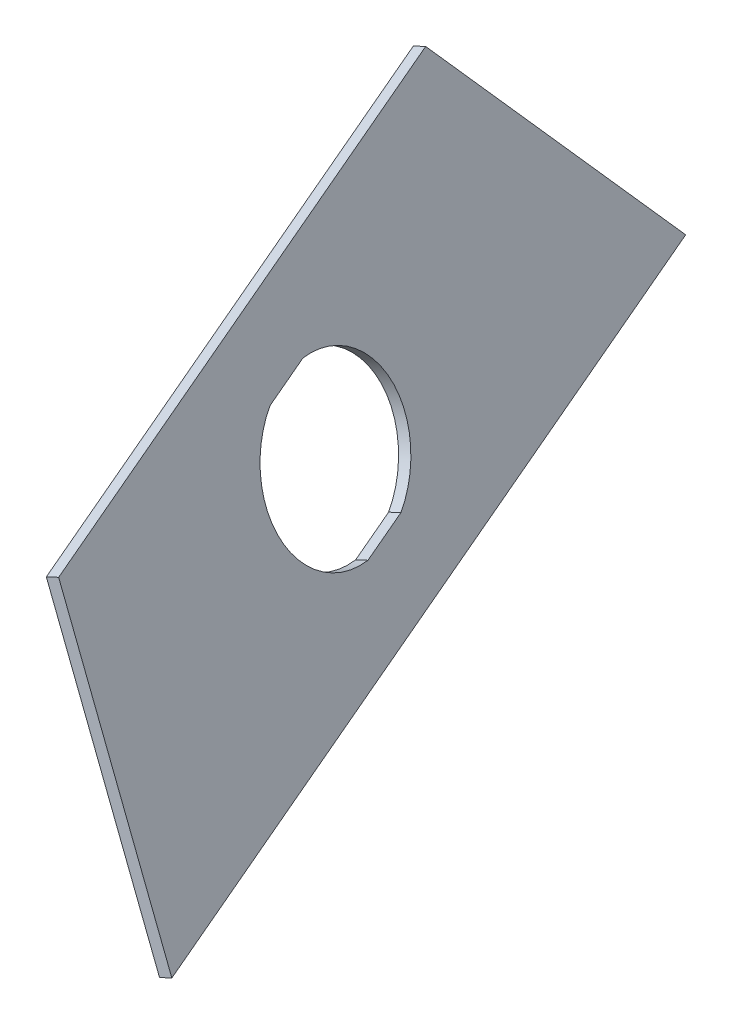
ISO-10303-21;
HEADER;
FILE_DESCRIPTION(('STEP AP214'),'2;1');
FILE_NAME('part.step','',(''),(''),'','','');
FILE_SCHEMA(('AUTOMOTIVE_DESIGN { 1 0 10303 214 1 1 1 1 }'));
ENDSEC;
DATA;
#1=APPLICATION_CONTEXT('core data for automotive mechanical design processes');
#2=APPLICATION_PROTOCOL_DEFINITION('international standard','automotive_design',2000,#1);
#3=PRODUCT_CONTEXT('',#1,'mechanical');
#4=PRODUCT('Part','Part','',(#3));
#5=PRODUCT_RELATED_PRODUCT_CATEGORY('part','',(#4));
#6=PRODUCT_DEFINITION_FORMATION('','',#4);
#7=PRODUCT_DEFINITION_CONTEXT('part definition',#1,'design');
#8=PRODUCT_DEFINITION('design','',#6,#7);
#9=PRODUCT_DEFINITION_SHAPE('','',#8);
#10=(LENGTH_UNIT() NAMED_UNIT(*) SI_UNIT(.MILLI.,.METRE.));
#11=(NAMED_UNIT(*) PLANE_ANGLE_UNIT() SI_UNIT($,.RADIAN.));
#12=(NAMED_UNIT(*) SI_UNIT($,.STERADIAN.) SOLID_ANGLE_UNIT());
#13=UNCERTAINTY_MEASURE_WITH_UNIT(LENGTH_MEASURE(1.E-05),#10,'distance_accuracy_value','');
#14=(GEOMETRIC_REPRESENTATION_CONTEXT(3) GLOBAL_UNCERTAINTY_ASSIGNED_CONTEXT((#13)) GLOBAL_UNIT_ASSIGNED_CONTEXT((#10,
#11,#12)) REPRESENTATION_CONTEXT('',''));
#15=CARTESIAN_POINT('',(0.,0.,0.));
#16=DIRECTION('',(0.,0.,1.));
#17=DIRECTION('',(1.,0.,0.));
#18=AXIS2_PLACEMENT_3D('',#15,#16,#17);
#19=CARTESIAN_POINT('',(458.420334770549,178.691758636198,-67.7030007615444));
#20=DIRECTION('',(0.923020405468225,0.359792371760229,-0.136318671914095));
#21=DIRECTION('',(0.363182667764732,-0.931717956162321,0.));
#22=AXIS2_PLACEMENT_3D('',#19,#20,#21);
#23=PLANE('',#22);
#24=DIRECTION('',(-0.243854446276022,0.273005986325031,-0.930592682360071));
#25=VECTOR('',#24,1.);
#26=CARTESIAN_POINT('',(128.763683655973,996.384967488977,-141.647653024973));
#27=LINE('',#26,#25);
#28=CARTESIAN_POINT('',(128.763683655973,996.384967488977,-141.647653024973));
#29=VERTEX_POINT('',#28);
#30=CARTESIAN_POINT('',(110.959125962403,1016.31796813114,-209.593066181555));
#31=VERTEX_POINT('',#30);
#32=EDGE_CURVE('E138',#29,#31,#27,.T.);
#33=ORIENTED_EDGE('',*,*,#32,.F.);
#34=DIRECTION('',(-0.363182667764733,0.93171795616232,0.));
#35=VECTOR('',#34,1.);
#36=CARTESIAN_POINT('',(144.228768588632,956.710449390366,-141.647653024972));
#37=LINE('',#36,#35);
#38=CARTESIAN_POINT('',(144.228768588632,956.710449390366,-141.647653024972));
#39=VERTEX_POINT('',#38);
#40=EDGE_CURVE('E148',#39,#29,#37,.T.);
#41=ORIENTED_EDGE('',*,*,#40,.F.);
#42=DIRECTION('',(0.243854446276023,-0.273005986325033,0.93059268236007));
#43=VECTOR('',#42,1.);
#44=CARTESIAN_POINT('',(119.302387817634,984.616650289393,-236.771231444188));
#45=LINE('',#44,#43);
#46=CARTESIAN_POINT('',(119.302387817634,984.616650289393,-236.771231444188));
#47=VERTEX_POINT('',#46);
#48=EDGE_CURVE('E145',#47,#39,#45,.T.);
#49=ORIENTED_EDGE('',*,*,#48,.F.);
#50=DIRECTION('',(0.195933492226962,-0.744475005184696,-0.638253110669265));
#51=VECTOR('',#50,1.);
#52=CARTESIAN_POINT('',(110.959125962403,1016.31796813114,-209.593066181555));
#53=LINE('',#52,#51);
#54=EDGE_CURVE('E141',#31,#47,#53,.T.);
#55=ORIENTED_EDGE('',*,*,#54,.F.);
#56=EDGE_LOOP('',(#33,#41,#49,#55));
#57=FACE_BOUND('',#56,.T.);
#58=DIRECTION('',(-0.243854446276021,0.273005986325033,-0.93059268236007));
#59=VECTOR('',#58,1.);
#60=CARTESIAN_POINT('',(121.889115720083,998.770697278187,-181.898918881072));
#61=LINE('',#60,#59);
#62=CARTESIAN_POINT('',(123.488176260416,996.980477306095,-175.79661457533));
#63=VERTEX_POINT('',#62);
#64=CARTESIAN_POINT('',(121.889115720084,998.770697278187,-181.898918881072));
#65=VERTEX_POINT('',#64);
#66=EDGE_CURVE('E119',#63,#65,#61,.T.);
#67=ORIENTED_EDGE('',*,*,#66,.T.);
#68=CARTESIAN_POINT('',(125.81349150616,988.507508824969,-182.414900918922));
#69=DIRECTION('',(-0.923020405468225,-0.359792371760229,0.136318671914095));
#70=DIRECTION('',(0.363182667764731,-0.931717956162321,0.));
#71=AXIS2_PLACEMENT_3D('',#68,#69,#70);
#72=CIRCLE('',#71,11.);
#73=CARTESIAN_POINT('',(128.138806751904,980.034540343844,-189.033187262513));
#74=VERTEX_POINT('',#73);
#75=EDGE_CURVE('E124',#65,#74,#72,.T.);
#76=ORIENTED_EDGE('',*,*,#75,.T.);
#77=DIRECTION('',(0.243854446276028,-0.273005986325065,0.930592682360059));
#78=VECTOR('',#77,1.);
#79=CARTESIAN_POINT('',(129.737867292237,978.244320371751,-182.930882956771));
#80=LINE('',#79,#78);
#81=CARTESIAN_POINT('',(129.737867292237,978.244320371751,-182.930882956771));
#82=VERTEX_POINT('',#81);
#83=EDGE_CURVE('E120',#74,#82,#80,.T.);
#84=ORIENTED_EDGE('',*,*,#83,.T.);
#85=CARTESIAN_POINT('',(125.81349150616,988.507508824969,-182.414900918922));
#86=DIRECTION('',(-0.923020405468225,-0.359792371760229,0.136318671914095));
#87=DIRECTION('',(0.363182667764731,-0.931717956162321,0.));
#88=AXIS2_PLACEMENT_3D('',#85,#86,#87);
#89=CIRCLE('',#88,11.0000000000001);
#90=EDGE_CURVE('E105',#82,#63,#89,.T.);
#91=ORIENTED_EDGE('',*,*,#90,.T.);
#92=EDGE_LOOP('',(#67,#76,#84,#91));
#93=FACE_BOUND('',#92,.T.);
#94=ADVANCED_FACE('F39',(#57,#93),#23,.T.);
#95=CARTESIAN_POINT('',(456.955039876868,178.120588246029,-67.4865948698808));
#96=DIRECTION('',(0.923020405468225,0.359792371760229,-0.136318671914095));
#97=DIRECTION('',(0.363182667764732,-0.931717956162321,0.));
#98=AXIS2_PLACEMENT_3D('',#95,#96,#97);
#99=PLANE('',#98);
#100=DIRECTION('',(-0.243854446276022,0.273005986325031,-0.930592682360071));
#101=VECTOR('',#100,1.);
#102=CARTESIAN_POINT('',(127.298388762292,995.813797098808,-141.431247133309));
#103=LINE('',#102,#101);
#104=CARTESIAN_POINT('',(127.298388762292,995.813797098808,-141.431247133309));
#105=VERTEX_POINT('',#104);
#106=CARTESIAN_POINT('',(109.493831068722,1015.74679774097,-209.376660289891));
#107=VERTEX_POINT('',#106);
#108=EDGE_CURVE('E113',#105,#107,#103,.T.);
#109=ORIENTED_EDGE('',*,*,#108,.T.);
#110=DIRECTION('',(0.195933492226962,-0.744475005184696,-0.638253110669265));
#111=VECTOR('',#110,1.);
#112=CARTESIAN_POINT('',(109.493831068722,1015.74679774097,-209.376660289891));
#113=LINE('',#112,#111);
#114=CARTESIAN_POINT('',(117.837092923953,984.045479899224,-236.554825552524));
#115=VERTEX_POINT('',#114);
#116=EDGE_CURVE('E154',#107,#115,#113,.T.);
#117=ORIENTED_EDGE('',*,*,#116,.T.);
#118=DIRECTION('',(0.243854446276023,-0.273005986325033,0.93059268236007));
#119=VECTOR('',#118,1.);
#120=CARTESIAN_POINT('',(117.837092923953,984.045479899224,-236.554825552524));
#121=LINE('',#120,#119);
#122=CARTESIAN_POINT('',(142.763473694951,956.139279000197,-141.431247133309));
#123=VERTEX_POINT('',#122);
#124=EDGE_CURVE('E157',#115,#123,#121,.T.);
#125=ORIENTED_EDGE('',*,*,#124,.T.);
#126=DIRECTION('',(-0.363182667764733,0.93171795616232,0.));
#127=VECTOR('',#126,1.);
#128=CARTESIAN_POINT('',(142.763473694951,956.139279000197,-141.431247133309));
#129=LINE('',#128,#127);
#130=EDGE_CURVE('E142',#123,#105,#129,.T.);
#131=ORIENTED_EDGE('',*,*,#130,.T.);
#132=EDGE_LOOP('',(#109,#117,#125,#131));
#133=FACE_BOUND('',#132,.T.);
#134=CARTESIAN_POINT('',(124.34819661248,987.9363384348,-182.198495027258));
#135=DIRECTION('',(-0.923020405468225,-0.359792371760229,0.136318671914095));
#136=DIRECTION('',(0.363182667764731,-0.931717956162321,0.));
#137=AXIS2_PLACEMENT_3D('',#134,#135,#136);
#138=CIRCLE('',#137,11.0000000000001);
#139=CARTESIAN_POINT('',(128.272572398556,977.673149981582,-182.714477065108));
#140=VERTEX_POINT('',#139);
#141=CARTESIAN_POINT('',(122.022881366735,996.409306915925,-175.580208683667));
#142=VERTEX_POINT('',#141);
#143=EDGE_CURVE('E108',#140,#142,#138,.T.);
#144=ORIENTED_EDGE('',*,*,#143,.F.);
#145=DIRECTION('',(0.243854446276028,-0.273005986325065,0.930592682360059));
#146=VECTOR('',#145,1.);
#147=CARTESIAN_POINT('',(128.272572398556,977.673149981582,-182.714477065108));
#148=LINE('',#147,#146);
#149=CARTESIAN_POINT('',(126.673511858224,979.463369953675,-188.816781370849));
#150=VERTEX_POINT('',#149);
#151=EDGE_CURVE('E121',#150,#140,#148,.T.);
#152=ORIENTED_EDGE('',*,*,#151,.F.);
#153=CARTESIAN_POINT('',(124.34819661248,987.9363384348,-182.198495027258));
#154=DIRECTION('',(-0.923020405468225,-0.359792371760229,0.136318671914095));
#155=DIRECTION('',(0.363182667764731,-0.931717956162321,0.));
#156=AXIS2_PLACEMENT_3D('',#153,#154,#155);
#157=CIRCLE('',#156,11.);
#158=CARTESIAN_POINT('',(120.423820826403,998.199526888018,-181.682512989408));
#159=VERTEX_POINT('',#158);
#160=EDGE_CURVE('E132',#159,#150,#157,.T.);
#161=ORIENTED_EDGE('',*,*,#160,.F.);
#162=DIRECTION('',(-0.243854446276021,0.273005986325033,-0.93059268236007));
#163=VECTOR('',#162,1.);
#164=CARTESIAN_POINT('',(120.423820826403,998.199526888018,-181.682512989408));
#165=LINE('',#164,#163);
#166=EDGE_CURVE('E130',#142,#159,#165,.T.);
#167=ORIENTED_EDGE('',*,*,#166,.F.);
#168=EDGE_LOOP('',(#144,#152,#161,#167));
#169=FACE_BOUND('',#168,.T.);
#170=ADVANCED_FACE('F174',(#133,#169),#99,.F.);
#171=CARTESIAN_POINT('',(128.763683655973,996.384967488977,-141.647653024973));
#172=DIRECTION('',(0.297604334848617,-0.89219794925445,-0.33972706578291));
#173=DIRECTION('',(0.,0.355850919999465,-0.934542734568909));
#174=AXIS2_PLACEMENT_3D('',#171,#172,#173);
#175=PLANE('',#174);
#176=ORIENTED_EDGE('',*,*,#108,.F.);
#177=DIRECTION('',(-0.923020405468225,-0.359792371760229,0.136318671914095));
#178=VECTOR('',#177,1.);
#179=CARTESIAN_POINT('',(128.763683655973,996.384967488977,-141.647653024973));
#180=LINE('',#179,#178);
#181=EDGE_CURVE('E151',#29,#105,#180,.T.);
#182=ORIENTED_EDGE('',*,*,#181,.F.);
#183=ORIENTED_EDGE('',*,*,#32,.T.);
#184=DIRECTION('',(-0.923020405468225,-0.359792371760229,0.136318671914095));
#185=VECTOR('',#184,1.);
#186=CARTESIAN_POINT('',(110.959125962403,1016.31796813114,-209.593066181555));
#187=LINE('',#186,#185);
#188=EDGE_CURVE('E11',#31,#107,#187,.T.);
#189=ORIENTED_EDGE('',*,*,#188,.T.);
#190=EDGE_LOOP('',(#176,#182,#183,#189));
#191=FACE_BOUND('',#190,.T.);
#192=ADVANCED_FACE('F41',(#191),#175,.F.);
#193=CARTESIAN_POINT('',(110.959125962403,1016.31796813114,-209.593066181555));
#194=DIRECTION('',(0.331124444451055,-0.562411251557431,0.757660997022141));
#195=DIRECTION('',(0.,-0.802958203384893,-0.596035337557184));
#196=AXIS2_PLACEMENT_3D('',#193,#194,#195);
#197=PLANE('',#196);
#198=ORIENTED_EDGE('',*,*,#116,.F.);
#199=ORIENTED_EDGE('',*,*,#188,.F.);
#200=ORIENTED_EDGE('',*,*,#54,.T.);
#201=DIRECTION('',(-0.923020405468225,-0.359792371760229,0.136318671914095));
#202=VECTOR('',#201,1.);
#203=CARTESIAN_POINT('',(119.302387817634,984.616650289393,-236.771231444188));
#204=LINE('',#203,#202);
#205=EDGE_CURVE('E47',#47,#115,#204,.T.);
#206=ORIENTED_EDGE('',*,*,#205,.T.);
#207=EDGE_LOOP('',(#198,#199,#200,#206));
#208=FACE_BOUND('',#207,.T.);
#209=ADVANCED_FACE('F167',(#208),#197,.F.);
#210=CARTESIAN_POINT('',(119.302387817634,984.616650289393,-236.771231444188));
#211=DIRECTION('',(-0.297604334848617,0.89219794925445,0.339727065782912));
#212=DIRECTION('',(0.,-0.355850919999467,0.934542734568908));
#213=AXIS2_PLACEMENT_3D('',#210,#211,#212);
#214=PLANE('',#213);
#215=ORIENTED_EDGE('',*,*,#124,.F.);
#216=ORIENTED_EDGE('',*,*,#205,.F.);
#217=ORIENTED_EDGE('',*,*,#48,.T.);
#218=DIRECTION('',(-0.923020405468225,-0.359792371760229,0.136318671914095));
#219=VECTOR('',#218,1.);
#220=CARTESIAN_POINT('',(144.228768588632,956.710449390366,-141.647653024972));
#221=LINE('',#220,#219);
#222=EDGE_CURVE('E163',#39,#123,#221,.T.);
#223=ORIENTED_EDGE('',*,*,#222,.T.);
#224=EDGE_LOOP('',(#215,#216,#217,#223));
#225=FACE_BOUND('',#224,.T.);
#226=ADVANCED_FACE('F171',(#225),#214,.F.);
#227=CARTESIAN_POINT('',(144.228768588632,956.710449390366,-141.647653024972));
#228=DIRECTION('',(-0.127010554382556,-0.0495085789319238,-0.990665039096251));
#229=DIRECTION('',(0.9918813848272,0.,-0.1271664988638));
#230=AXIS2_PLACEMENT_3D('',#227,#228,#229);
#231=PLANE('',#230);
#232=ORIENTED_EDGE('',*,*,#130,.F.);
#233=ORIENTED_EDGE('',*,*,#222,.F.);
#234=ORIENTED_EDGE('',*,*,#40,.T.);
#235=ORIENTED_EDGE('',*,*,#181,.T.);
#236=EDGE_LOOP('',(#232,#233,#234,#235));
#237=FACE_BOUND('',#236,.T.);
#238=ADVANCED_FACE('F182',(#237),#231,.F.);
#239=CARTESIAN_POINT('',(125.81349150616,988.507508824969,-182.414900918922));
#240=DIRECTION('',(-0.923020405468225,-0.359792371760229,0.136318671914095));
#241=DIRECTION('',(-0.363182667764732,0.931717956162321,0.));
#242=AXIS2_PLACEMENT_3D('',#239,#240,#241);
#243=CYLINDRICAL_SURFACE('',#242,11.0000000000001);
#244=ORIENTED_EDGE('',*,*,#143,.T.);
#245=DIRECTION('',(-0.923020405468225,-0.359792371760229,0.136318671914095));
#246=VECTOR('',#245,1.);
#247=CARTESIAN_POINT('',(123.488176260416,996.980477306095,-175.79661457533));
#248=LINE('',#247,#246);
#249=EDGE_CURVE('E102',#63,#142,#248,.T.);
#250=ORIENTED_EDGE('',*,*,#249,.F.);
#251=ORIENTED_EDGE('',*,*,#90,.F.);
#252=DIRECTION('',(-0.923020405468225,-0.359792371760229,0.136318671914095));
#253=VECTOR('',#252,1.);
#254=CARTESIAN_POINT('',(129.737867292237,978.244320371751,-182.930882956771));
#255=LINE('',#254,#253);
#256=EDGE_CURVE('E62',#82,#140,#255,.T.);
#257=ORIENTED_EDGE('',*,*,#256,.T.);
#258=EDGE_LOOP('',(#244,#250,#251,#257));
#259=FACE_BOUND('',#258,.T.);
#260=ADVANCED_FACE('F104',(#259),#243,.F.);
#261=CARTESIAN_POINT('',(121.889115720083,998.770697278187,-181.898918881072));
#262=DIRECTION('',(0.297604334848617,-0.89219794925445,-0.339727065782912));
#263=DIRECTION('',(0.,0.355850919999467,-0.934542734568908));
#264=AXIS2_PLACEMENT_3D('',#261,#262,#263);
#265=PLANE('',#264);
#266=ORIENTED_EDGE('',*,*,#166,.T.);
#267=DIRECTION('',(-0.923020405468225,-0.359792371760229,0.136318671914095));
#268=VECTOR('',#267,1.);
#269=CARTESIAN_POINT('',(121.889115720084,998.770697278187,-181.898918881072));
#270=LINE('',#269,#268);
#271=EDGE_CURVE('E114',#65,#159,#270,.T.);
#272=ORIENTED_EDGE('',*,*,#271,.F.);
#273=ORIENTED_EDGE('',*,*,#66,.F.);
#274=ORIENTED_EDGE('',*,*,#249,.T.);
#275=EDGE_LOOP('',(#266,#272,#273,#274));
#276=FACE_BOUND('',#275,.T.);
#277=ADVANCED_FACE('F123',(#276),#265,.T.);
#278=CARTESIAN_POINT('',(125.81349150616,988.507508824969,-182.414900918922));
#279=DIRECTION('',(-0.923020405468225,-0.359792371760229,0.136318671914095));
#280=DIRECTION('',(-0.363182667764732,0.931717956162321,0.));
#281=AXIS2_PLACEMENT_3D('',#278,#279,#280);
#282=CYLINDRICAL_SURFACE('',#281,11.);
#283=ORIENTED_EDGE('',*,*,#160,.T.);
#284=DIRECTION('',(-0.923020405468225,-0.359792371760229,0.136318671914095));
#285=VECTOR('',#284,1.);
#286=CARTESIAN_POINT('',(128.138806751904,980.034540343844,-189.033187262513));
#287=LINE('',#286,#285);
#288=EDGE_CURVE('E54',#74,#150,#287,.T.);
#289=ORIENTED_EDGE('',*,*,#288,.F.);
#290=ORIENTED_EDGE('',*,*,#75,.F.);
#291=ORIENTED_EDGE('',*,*,#271,.T.);
#292=EDGE_LOOP('',(#283,#289,#290,#291));
#293=FACE_BOUND('',#292,.T.);
#294=ADVANCED_FACE('F200',(#293),#282,.F.);
#295=CARTESIAN_POINT('',(129.737867292237,978.244320371751,-182.930882956771));
#296=DIRECTION('',(-0.297604334848608,0.89219794925444,0.339727065782944));
#297=DIRECTION('',(0.,-0.3558509199995,0.934542734568896));
#298=AXIS2_PLACEMENT_3D('',#295,#296,#297);
#299=PLANE('',#298);
#300=ORIENTED_EDGE('',*,*,#151,.T.);
#301=ORIENTED_EDGE('',*,*,#256,.F.);
#302=ORIENTED_EDGE('',*,*,#83,.F.);
#303=ORIENTED_EDGE('',*,*,#288,.T.);
#304=EDGE_LOOP('',(#300,#301,#302,#303));
#305=FACE_BOUND('',#304,.T.);
#306=ADVANCED_FACE('F203',(#305),#299,.T.);
#307=CLOSED_SHELL('',(#94,#170,#192,#209,#226,#238,#260,#277,#294,#306));
#308=MANIFOLD_SOLID_BREP('B2',#307);
#309=ADVANCED_BREP_SHAPE_REPRESENTATION('',(#18,#308),#14);
#310=SHAPE_DEFINITION_REPRESENTATION(#9,#309);
ENDSEC;
END-ISO-10303-21;
